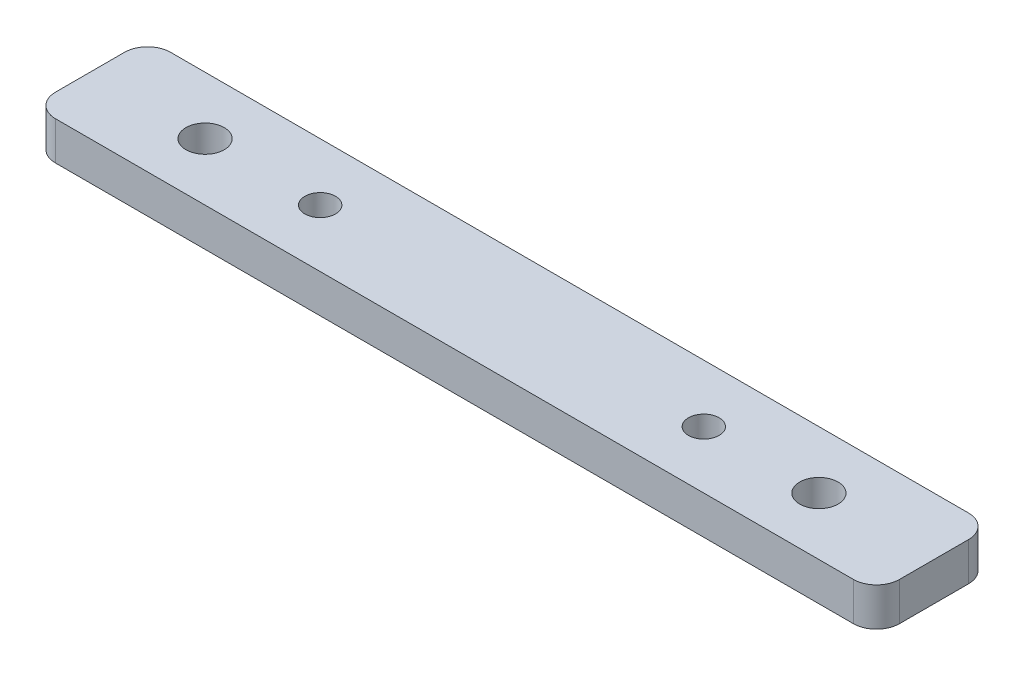
ISO-10303-21;
HEADER;
FILE_DESCRIPTION(('STEP AP214'),'2;1');
FILE_NAME('part.step','',(''),(''),'','','');
FILE_SCHEMA(('AUTOMOTIVE_DESIGN { 1 0 10303 214 1 1 1 1 }'));
ENDSEC;
DATA;
#1=APPLICATION_CONTEXT('core data for automotive mechanical design processes');
#2=APPLICATION_PROTOCOL_DEFINITION('international standard','automotive_design',2000,#1);
#3=PRODUCT_CONTEXT('',#1,'mechanical');
#4=PRODUCT('Part','Part','',(#3));
#5=PRODUCT_RELATED_PRODUCT_CATEGORY('part','',(#4));
#6=PRODUCT_DEFINITION_FORMATION('','',#4);
#7=PRODUCT_DEFINITION_CONTEXT('part definition',#1,'design');
#8=PRODUCT_DEFINITION('design','',#6,#7);
#9=PRODUCT_DEFINITION_SHAPE('','',#8);
#10=(LENGTH_UNIT() NAMED_UNIT(*) SI_UNIT(.MILLI.,.METRE.));
#11=(NAMED_UNIT(*) PLANE_ANGLE_UNIT() SI_UNIT($,.RADIAN.));
#12=(NAMED_UNIT(*) SI_UNIT($,.STERADIAN.) SOLID_ANGLE_UNIT());
#13=UNCERTAINTY_MEASURE_WITH_UNIT(LENGTH_MEASURE(1.E-05),#10,'distance_accuracy_value','');
#14=(GEOMETRIC_REPRESENTATION_CONTEXT(3) GLOBAL_UNCERTAINTY_ASSIGNED_CONTEXT((#13)) GLOBAL_UNIT_ASSIGNED_CONTEXT((#10,
#11,#12)) REPRESENTATION_CONTEXT('',''));
#15=CARTESIAN_POINT('',(0.,0.,0.));
#16=DIRECTION('',(0.,0.,1.));
#17=DIRECTION('',(1.,0.,0.));
#18=AXIS2_PLACEMENT_3D('',#15,#16,#17);
#19=CARTESIAN_POINT('',(55.,5.,7.5));
#20=DIRECTION('',(-1.,0.,0.));
#21=DIRECTION('',(0.,0.,1.));
#22=AXIS2_PLACEMENT_3D('',#19,#20,#21);
#23=PLANE('',#22);
#24=DIRECTION('',(0.,0.,-1.));
#25=VECTOR('',#24,1.);
#26=CARTESIAN_POINT('',(55.,5.,7.5));
#27=LINE('',#26,#25);
#28=CARTESIAN_POINT('',(55.,5.,4.5));
#29=VERTEX_POINT('',#28);
#30=CARTESIAN_POINT('',(55.,5.,-4.5));
#31=VERTEX_POINT('',#30);
#32=EDGE_CURVE('E137',#29,#31,#27,.T.);
#33=ORIENTED_EDGE('',*,*,#32,.F.);
#34=DIRECTION('',(0.,-1.,0.));
#35=VECTOR('',#34,1.);
#36=CARTESIAN_POINT('',(55.,5.,4.5));
#37=LINE('',#36,#35);
#38=CARTESIAN_POINT('',(55.,0.,4.5));
#39=VERTEX_POINT('',#38);
#40=EDGE_CURVE('E11',#29,#39,#37,.T.);
#41=ORIENTED_EDGE('',*,*,#40,.T.);
#42=DIRECTION('',(0.,0.,-1.));
#43=VECTOR('',#42,1.);
#44=CARTESIAN_POINT('',(55.,0.,7.5));
#45=LINE('',#44,#43);
#46=CARTESIAN_POINT('',(55.,0.,-4.5));
#47=VERTEX_POINT('',#46);
#48=EDGE_CURVE('E183',#39,#47,#45,.T.);
#49=ORIENTED_EDGE('',*,*,#48,.T.);
#50=DIRECTION('',(0.,-1.,0.));
#51=VECTOR('',#50,1.);
#52=CARTESIAN_POINT('',(55.,5.,-4.5));
#53=LINE('',#52,#51);
#54=EDGE_CURVE('E48',#47,#31,#53,.F.);
#55=ORIENTED_EDGE('',*,*,#54,.T.);
#56=EDGE_LOOP('',(#33,#41,#49,#55));
#57=FACE_BOUND('',#56,.T.);
#58=ADVANCED_FACE('F39',(#57),#23,.F.);
#59=CARTESIAN_POINT('',(-55.,5.,-7.5));
#60=DIRECTION('',(0.,0.,1.));
#61=DIRECTION('',(1.,0.,0.));
#62=AXIS2_PLACEMENT_3D('',#59,#60,#61);
#63=PLANE('',#62);
#64=DIRECTION('',(-1.,0.,0.));
#65=VECTOR('',#64,1.);
#66=CARTESIAN_POINT('',(-55.,0.,-7.5));
#67=LINE('',#66,#65);
#68=CARTESIAN_POINT('',(52.,0.,-7.5));
#69=VERTEX_POINT('',#68);
#70=CARTESIAN_POINT('',(-52.,0.,-7.5));
#71=VERTEX_POINT('',#70);
#72=EDGE_CURVE('E144',#69,#71,#67,.T.);
#73=ORIENTED_EDGE('',*,*,#72,.T.);
#74=DIRECTION('',(0.,-1.,0.));
#75=VECTOR('',#74,1.);
#76=CARTESIAN_POINT('',(-52.,5.,-7.5));
#77=LINE('',#76,#75);
#78=CARTESIAN_POINT('',(-52.,5.,-7.5));
#79=VERTEX_POINT('',#78);
#80=EDGE_CURVE('E55',#71,#79,#77,.F.);
#81=ORIENTED_EDGE('',*,*,#80,.T.);
#82=DIRECTION('',(-1.,0.,0.));
#83=VECTOR('',#82,1.);
#84=CARTESIAN_POINT('',(-55.,5.,-7.5));
#85=LINE('',#84,#83);
#86=CARTESIAN_POINT('',(52.,5.,-7.5));
#87=VERTEX_POINT('',#86);
#88=EDGE_CURVE('E142',#87,#79,#85,.T.);
#89=ORIENTED_EDGE('',*,*,#88,.F.);
#90=DIRECTION('',(0.,-1.,0.));
#91=VECTOR('',#90,1.);
#92=CARTESIAN_POINT('',(52.,5.,-7.5));
#93=LINE('',#92,#91);
#94=EDGE_CURVE('E172',#87,#69,#93,.T.);
#95=ORIENTED_EDGE('',*,*,#94,.T.);
#96=EDGE_LOOP('',(#73,#81,#89,#95));
#97=FACE_BOUND('',#96,.T.);
#98=ADVANCED_FACE('F190',(#97),#63,.F.);
#99=CARTESIAN_POINT('',(-55.,5.,7.5));
#100=DIRECTION('',(1.,0.,0.));
#101=DIRECTION('',(0.,0.,-1.));
#102=AXIS2_PLACEMENT_3D('',#99,#100,#101);
#103=PLANE('',#102);
#104=DIRECTION('',(0.,0.,1.));
#105=VECTOR('',#104,1.);
#106=CARTESIAN_POINT('',(-55.,0.,7.5));
#107=LINE('',#106,#105);
#108=CARTESIAN_POINT('',(-55.,0.,-4.5));
#109=VERTEX_POINT('',#108);
#110=CARTESIAN_POINT('',(-55.,0.,4.5));
#111=VERTEX_POINT('',#110);
#112=EDGE_CURVE('E138',#109,#111,#107,.T.);
#113=ORIENTED_EDGE('',*,*,#112,.T.);
#114=DIRECTION('',(0.,-1.,0.));
#115=VECTOR('',#114,1.);
#116=CARTESIAN_POINT('',(-55.,5.,4.5));
#117=LINE('',#116,#115);
#118=CARTESIAN_POINT('',(-55.,5.,4.5));
#119=VERTEX_POINT('',#118);
#120=EDGE_CURVE('E112',#111,#119,#117,.F.);
#121=ORIENTED_EDGE('',*,*,#120,.T.);
#122=DIRECTION('',(0.,0.,1.));
#123=VECTOR('',#122,1.);
#124=CARTESIAN_POINT('',(-55.,5.,7.5));
#125=LINE('',#124,#123);
#126=CARTESIAN_POINT('',(-55.,5.,-4.5));
#127=VERTEX_POINT('',#126);
#128=EDGE_CURVE('E198',#127,#119,#125,.T.);
#129=ORIENTED_EDGE('',*,*,#128,.F.);
#130=DIRECTION('',(0.,-1.,0.));
#131=VECTOR('',#130,1.);
#132=CARTESIAN_POINT('',(-55.,5.,-4.5));
#133=LINE('',#132,#131);
#134=EDGE_CURVE('E118',#127,#109,#133,.T.);
#135=ORIENTED_EDGE('',*,*,#134,.T.);
#136=EDGE_LOOP('',(#113,#121,#129,#135));
#137=FACE_BOUND('',#136,.T.);
#138=ADVANCED_FACE('F272',(#137),#103,.F.);
#139=CARTESIAN_POINT('',(-55.,5.,7.5));
#140=DIRECTION('',(0.,0.,-1.));
#141=DIRECTION('',(-1.,0.,0.));
#142=AXIS2_PLACEMENT_3D('',#139,#140,#141);
#143=PLANE('',#142);
#144=DIRECTION('',(1.,0.,0.));
#145=VECTOR('',#144,1.);
#146=CARTESIAN_POINT('',(-55.,5.,7.5));
#147=LINE('',#146,#145);
#148=CARTESIAN_POINT('',(-52.,5.,7.5));
#149=VERTEX_POINT('',#148);
#150=CARTESIAN_POINT('',(52.,5.,7.5));
#151=VERTEX_POINT('',#150);
#152=EDGE_CURVE('E128',#149,#151,#147,.T.);
#153=ORIENTED_EDGE('',*,*,#152,.F.);
#154=DIRECTION('',(0.,-1.,0.));
#155=VECTOR('',#154,1.);
#156=CARTESIAN_POINT('',(-52.,5.,7.5));
#157=LINE('',#156,#155);
#158=CARTESIAN_POINT('',(-52.,0.,7.5));
#159=VERTEX_POINT('',#158);
#160=EDGE_CURVE('E111',#149,#159,#157,.T.);
#161=ORIENTED_EDGE('',*,*,#160,.T.);
#162=DIRECTION('',(1.,0.,0.));
#163=VECTOR('',#162,1.);
#164=CARTESIAN_POINT('',(-55.,0.,7.5));
#165=LINE('',#164,#163);
#166=CARTESIAN_POINT('',(52.,0.,7.5));
#167=VERTEX_POINT('',#166);
#168=EDGE_CURVE('E125',#159,#167,#165,.T.);
#169=ORIENTED_EDGE('',*,*,#168,.T.);
#170=DIRECTION('',(0.,-1.,0.));
#171=VECTOR('',#170,1.);
#172=CARTESIAN_POINT('',(52.,5.,7.5));
#173=LINE('',#172,#171);
#174=EDGE_CURVE('E131',#167,#151,#173,.F.);
#175=ORIENTED_EDGE('',*,*,#174,.T.);
#176=EDGE_LOOP('',(#153,#161,#169,#175));
#177=FACE_BOUND('',#176,.T.);
#178=ADVANCED_FACE('F124',(#177),#143,.F.);
#179=CARTESIAN_POINT('',(0.,5.,0.));
#180=DIRECTION('',(0.,-1.,0.));
#181=DIRECTION('',(0.,0.,-1.));
#182=AXIS2_PLACEMENT_3D('',#179,#180,#181);
#183=PLANE('',#182);
#184=CARTESIAN_POINT('',(40.,5.,0.));
#185=DIRECTION('',(0.,1.,0.));
#186=DIRECTION('',(0.,0.,1.));
#187=AXIS2_PLACEMENT_3D('',#184,#185,#186);
#188=CIRCLE('',#187,2.5);
#189=CARTESIAN_POINT('',(40.,5.,2.5));
#190=VERTEX_POINT('',#189);
#191=EDGE_CURVE('E220',#190,#190,#188,.T.);
#192=ORIENTED_EDGE('',*,*,#191,.F.);
#193=EDGE_LOOP('',(#192));
#194=FACE_BOUND('',#193,.T.);
#195=CARTESIAN_POINT('',(-25.,5.,2.30718222304915E-13));
#196=DIRECTION('',(0.,1.,0.));
#197=DIRECTION('',(0.,0.,-1.));
#198=AXIS2_PLACEMENT_3D('',#195,#196,#197);
#199=CIRCLE('',#198,2.);
#200=CARTESIAN_POINT('',(-25.,5.,-1.99999999999977));
#201=VERTEX_POINT('',#200);
#202=EDGE_CURVE('E221',#201,#201,#199,.T.);
#203=ORIENTED_EDGE('',*,*,#202,.F.);
#204=EDGE_LOOP('',(#203));
#205=FACE_BOUND('',#204,.T.);
#206=CARTESIAN_POINT('',(-40.,5.,3.6949610038306E-13));
#207=DIRECTION('',(0.,1.,0.));
#208=DIRECTION('',(0.,0.,-1.));
#209=AXIS2_PLACEMENT_3D('',#206,#207,#208);
#210=CIRCLE('',#209,2.5);
#211=CARTESIAN_POINT('',(-40.,5.,-2.49999999999963));
#212=VERTEX_POINT('',#211);
#213=EDGE_CURVE('E203',#212,#212,#210,.T.);
#214=ORIENTED_EDGE('',*,*,#213,.F.);
#215=EDGE_LOOP('',(#214));
#216=FACE_BOUND('',#215,.T.);
#217=CARTESIAN_POINT('',(25.,5.,0.));
#218=DIRECTION('',(0.,1.,0.));
#219=DIRECTION('',(0.,0.,1.));
#220=AXIS2_PLACEMENT_3D('',#217,#218,#219);
#221=CIRCLE('',#220,2.);
#222=CARTESIAN_POINT('',(25.,5.,2.));
#223=VERTEX_POINT('',#222);
#224=EDGE_CURVE('E212',#223,#223,#221,.T.);
#225=ORIENTED_EDGE('',*,*,#224,.F.);
#226=EDGE_LOOP('',(#225));
#227=FACE_BOUND('',#226,.T.);
#228=ORIENTED_EDGE('',*,*,#128,.T.);
#229=CARTESIAN_POINT('',(-52.,5.,4.5));
#230=DIRECTION('',(0.,-1.,0.));
#231=DIRECTION('',(0.,0.,-1.));
#232=AXIS2_PLACEMENT_3D('',#229,#230,#231);
#233=CIRCLE('',#232,3.);
#234=EDGE_CURVE('E169',#119,#149,#233,.F.);
#235=ORIENTED_EDGE('',*,*,#234,.T.);
#236=ORIENTED_EDGE('',*,*,#152,.T.);
#237=CARTESIAN_POINT('',(52.,5.,4.5));
#238=DIRECTION('',(0.,-1.,0.));
#239=DIRECTION('',(0.,0.,-1.));
#240=AXIS2_PLACEMENT_3D('',#237,#238,#239);
#241=CIRCLE('',#240,3.);
#242=EDGE_CURVE('E163',#151,#29,#241,.F.);
#243=ORIENTED_EDGE('',*,*,#242,.T.);
#244=ORIENTED_EDGE('',*,*,#32,.T.);
#245=CARTESIAN_POINT('',(52.,5.,-4.5));
#246=DIRECTION('',(0.,-1.,0.));
#247=DIRECTION('',(0.,0.,-1.));
#248=AXIS2_PLACEMENT_3D('',#245,#246,#247);
#249=CIRCLE('',#248,3.);
#250=EDGE_CURVE('E62',#31,#87,#249,.F.);
#251=ORIENTED_EDGE('',*,*,#250,.T.);
#252=ORIENTED_EDGE('',*,*,#88,.T.);
#253=CARTESIAN_POINT('',(-52.,5.,-4.5));
#254=DIRECTION('',(0.,-1.,0.));
#255=DIRECTION('',(0.,0.,-1.));
#256=AXIS2_PLACEMENT_3D('',#253,#254,#255);
#257=CIRCLE('',#256,3.);
#258=EDGE_CURVE('E166',#79,#127,#257,.F.);
#259=ORIENTED_EDGE('',*,*,#258,.T.);
#260=EDGE_LOOP('',(#228,#235,#236,#243,#244,#251,#252,#259));
#261=FACE_BOUND('',#260,.T.);
#262=ADVANCED_FACE('F186',(#194,#205,#216,#227,#261),#183,.F.);
#263=CARTESIAN_POINT('',(0.,0.,0.));
#264=DIRECTION('',(0.,-1.,0.));
#265=DIRECTION('',(0.,0.,-1.));
#266=AXIS2_PLACEMENT_3D('',#263,#264,#265);
#267=PLANE('',#266);
#268=CARTESIAN_POINT('',(40.,0.,0.));
#269=DIRECTION('',(0.,1.,0.));
#270=DIRECTION('',(0.,0.,1.));
#271=AXIS2_PLACEMENT_3D('',#268,#269,#270);
#272=CIRCLE('',#271,2.5);
#273=CARTESIAN_POINT('',(40.,0.,2.5));
#274=VERTEX_POINT('',#273);
#275=EDGE_CURVE('E193',#274,#274,#272,.T.);
#276=ORIENTED_EDGE('',*,*,#275,.T.);
#277=EDGE_LOOP('',(#276));
#278=FACE_BOUND('',#277,.T.);
#279=CARTESIAN_POINT('',(-25.,0.,2.30718222304915E-13));
#280=DIRECTION('',(0.,1.,0.));
#281=DIRECTION('',(0.,0.,-1.));
#282=AXIS2_PLACEMENT_3D('',#279,#280,#281);
#283=CIRCLE('',#282,2.);
#284=CARTESIAN_POINT('',(-25.,0.,-1.99999999999977));
#285=VERTEX_POINT('',#284);
#286=EDGE_CURVE('E208',#285,#285,#283,.T.);
#287=ORIENTED_EDGE('',*,*,#286,.T.);
#288=EDGE_LOOP('',(#287));
#289=FACE_BOUND('',#288,.T.);
#290=CARTESIAN_POINT('',(-40.,0.,3.6949610038306E-13));
#291=DIRECTION('',(0.,1.,0.));
#292=DIRECTION('',(0.,0.,-1.));
#293=AXIS2_PLACEMENT_3D('',#290,#291,#292);
#294=CIRCLE('',#293,2.5);
#295=CARTESIAN_POINT('',(-40.,0.,-2.49999999999963));
#296=VERTEX_POINT('',#295);
#297=EDGE_CURVE('E207',#296,#296,#294,.T.);
#298=ORIENTED_EDGE('',*,*,#297,.T.);
#299=EDGE_LOOP('',(#298));
#300=FACE_BOUND('',#299,.T.);
#301=CARTESIAN_POINT('',(25.,0.,0.));
#302=DIRECTION('',(0.,1.,0.));
#303=DIRECTION('',(0.,0.,1.));
#304=AXIS2_PLACEMENT_3D('',#301,#302,#303);
#305=CIRCLE('',#304,2.);
#306=CARTESIAN_POINT('',(25.,0.,2.));
#307=VERTEX_POINT('',#306);
#308=EDGE_CURVE('E216',#307,#307,#305,.T.);
#309=ORIENTED_EDGE('',*,*,#308,.T.);
#310=EDGE_LOOP('',(#309));
#311=FACE_BOUND('',#310,.T.);
#312=ORIENTED_EDGE('',*,*,#168,.F.);
#313=CARTESIAN_POINT('',(-52.,0.,4.5));
#314=DIRECTION('',(0.,-1.,0.));
#315=DIRECTION('',(0.,0.,-1.));
#316=AXIS2_PLACEMENT_3D('',#313,#314,#315);
#317=CIRCLE('',#316,3.);
#318=EDGE_CURVE('E107',#159,#111,#317,.T.);
#319=ORIENTED_EDGE('',*,*,#318,.T.);
#320=ORIENTED_EDGE('',*,*,#112,.F.);
#321=CARTESIAN_POINT('',(-52.,0.,-4.5));
#322=DIRECTION('',(0.,-1.,0.));
#323=DIRECTION('',(0.,0.,-1.));
#324=AXIS2_PLACEMENT_3D('',#321,#322,#323);
#325=CIRCLE('',#324,3.);
#326=EDGE_CURVE('E119',#109,#71,#325,.T.);
#327=ORIENTED_EDGE('',*,*,#326,.T.);
#328=ORIENTED_EDGE('',*,*,#72,.F.);
#329=CARTESIAN_POINT('',(52.,0.,-4.5));
#330=DIRECTION('',(0.,-1.,0.));
#331=DIRECTION('',(0.,0.,-1.));
#332=AXIS2_PLACEMENT_3D('',#329,#330,#331);
#333=CIRCLE('',#332,3.);
#334=EDGE_CURVE('E130',#69,#47,#333,.T.);
#335=ORIENTED_EDGE('',*,*,#334,.T.);
#336=ORIENTED_EDGE('',*,*,#48,.F.);
#337=CARTESIAN_POINT('',(52.,0.,4.5));
#338=DIRECTION('',(0.,-1.,0.));
#339=DIRECTION('',(0.,0.,-1.));
#340=AXIS2_PLACEMENT_3D('',#337,#338,#339);
#341=CIRCLE('',#340,3.);
#342=EDGE_CURVE('E135',#39,#167,#341,.T.);
#343=ORIENTED_EDGE('',*,*,#342,.T.);
#344=EDGE_LOOP('',(#312,#319,#320,#327,#328,#335,#336,#343));
#345=FACE_BOUND('',#344,.T.);
#346=ADVANCED_FACE('F133',(#278,#289,#300,#311,#345),#267,.T.);
#347=CARTESIAN_POINT('',(-52.,5.,4.5));
#348=DIRECTION('',(0.,-1.,0.));
#349=DIRECTION('',(0.,0.,-1.));
#350=AXIS2_PLACEMENT_3D('',#347,#348,#349);
#351=CYLINDRICAL_SURFACE('',#350,3.);
#352=ORIENTED_EDGE('',*,*,#234,.F.);
#353=ORIENTED_EDGE('',*,*,#120,.F.);
#354=ORIENTED_EDGE('',*,*,#318,.F.);
#355=ORIENTED_EDGE('',*,*,#160,.F.);
#356=EDGE_LOOP('',(#352,#353,#354,#355));
#357=FACE_BOUND('',#356,.T.);
#358=ADVANCED_FACE('F110',(#357),#351,.T.);
#359=CARTESIAN_POINT('',(-52.,5.,-4.5));
#360=DIRECTION('',(0.,-1.,0.));
#361=DIRECTION('',(0.,0.,-1.));
#362=AXIS2_PLACEMENT_3D('',#359,#360,#361);
#363=CYLINDRICAL_SURFACE('',#362,3.);
#364=ORIENTED_EDGE('',*,*,#258,.F.);
#365=ORIENTED_EDGE('',*,*,#80,.F.);
#366=ORIENTED_EDGE('',*,*,#326,.F.);
#367=ORIENTED_EDGE('',*,*,#134,.F.);
#368=EDGE_LOOP('',(#364,#365,#366,#367));
#369=FACE_BOUND('',#368,.T.);
#370=ADVANCED_FACE('F278',(#369),#363,.T.);
#371=CARTESIAN_POINT('',(52.,5.,4.5));
#372=DIRECTION('',(0.,-1.,0.));
#373=DIRECTION('',(0.,0.,-1.));
#374=AXIS2_PLACEMENT_3D('',#371,#372,#373);
#375=CYLINDRICAL_SURFACE('',#374,3.);
#376=ORIENTED_EDGE('',*,*,#242,.F.);
#377=ORIENTED_EDGE('',*,*,#174,.F.);
#378=ORIENTED_EDGE('',*,*,#342,.F.);
#379=ORIENTED_EDGE('',*,*,#40,.F.);
#380=EDGE_LOOP('',(#376,#377,#378,#379));
#381=FACE_BOUND('',#380,.T.);
#382=ADVANCED_FACE('F264',(#381),#375,.T.);
#383=CARTESIAN_POINT('',(52.,5.,-4.5));
#384=DIRECTION('',(0.,-1.,0.));
#385=DIRECTION('',(0.,0.,-1.));
#386=AXIS2_PLACEMENT_3D('',#383,#384,#385);
#387=CYLINDRICAL_SURFACE('',#386,3.);
#388=ORIENTED_EDGE('',*,*,#250,.F.);
#389=ORIENTED_EDGE('',*,*,#54,.F.);
#390=ORIENTED_EDGE('',*,*,#334,.F.);
#391=ORIENTED_EDGE('',*,*,#94,.F.);
#392=EDGE_LOOP('',(#388,#389,#390,#391));
#393=FACE_BOUND('',#392,.T.);
#394=ADVANCED_FACE('F41',(#393),#387,.T.);
#395=CARTESIAN_POINT('',(25.,0.,0.));
#396=DIRECTION('',(0.,1.,0.));
#397=DIRECTION('',(0.,0.,1.));
#398=AXIS2_PLACEMENT_3D('',#395,#396,#397);
#399=CYLINDRICAL_SURFACE('',#398,2.);
#400=ORIENTED_EDGE('',*,*,#308,.F.);
#401=EDGE_LOOP('',(#400));
#402=FACE_BOUND('',#401,.T.);
#403=ORIENTED_EDGE('',*,*,#224,.T.);
#404=EDGE_LOOP('',(#403));
#405=FACE_BOUND('',#404,.T.);
#406=ADVANCED_FACE('F253',(#402,#405),#399,.F.);
#407=CARTESIAN_POINT('',(-40.,0.,3.6949610038306E-13));
#408=DIRECTION('',(0.,1.,0.));
#409=DIRECTION('',(0.,0.,1.));
#410=AXIS2_PLACEMENT_3D('',#407,#408,#409);
#411=CYLINDRICAL_SURFACE('',#410,2.5);
#412=ORIENTED_EDGE('',*,*,#297,.F.);
#413=EDGE_LOOP('',(#412));
#414=FACE_BOUND('',#413,.T.);
#415=ORIENTED_EDGE('',*,*,#213,.T.);
#416=EDGE_LOOP('',(#415));
#417=FACE_BOUND('',#416,.T.);
#418=ADVANCED_FACE('F255',(#414,#417),#411,.F.);
#419=CARTESIAN_POINT('',(-25.,0.,2.30718222304915E-13));
#420=DIRECTION('',(0.,1.,0.));
#421=DIRECTION('',(0.,0.,1.));
#422=AXIS2_PLACEMENT_3D('',#419,#420,#421);
#423=CYLINDRICAL_SURFACE('',#422,2.);
#424=ORIENTED_EDGE('',*,*,#286,.F.);
#425=EDGE_LOOP('',(#424));
#426=FACE_BOUND('',#425,.T.);
#427=ORIENTED_EDGE('',*,*,#202,.T.);
#428=EDGE_LOOP('',(#427));
#429=FACE_BOUND('',#428,.T.);
#430=ADVANCED_FACE('F240',(#426,#429),#423,.F.);
#431=CARTESIAN_POINT('',(40.,0.,0.));
#432=DIRECTION('',(0.,1.,0.));
#433=DIRECTION('',(0.,0.,1.));
#434=AXIS2_PLACEMENT_3D('',#431,#432,#433);
#435=CYLINDRICAL_SURFACE('',#434,2.5);
#436=ORIENTED_EDGE('',*,*,#275,.F.);
#437=EDGE_LOOP('',(#436));
#438=FACE_BOUND('',#437,.T.);
#439=ORIENTED_EDGE('',*,*,#191,.T.);
#440=EDGE_LOOP('',(#439));
#441=FACE_BOUND('',#440,.T.);
#442=ADVANCED_FACE('F237',(#438,#441),#435,.F.);
#443=CLOSED_SHELL('',(#58,#98,#138,#178,#262,#346,#358,#370,#382,#394,#406,#418,#430,#442));
#444=MANIFOLD_SOLID_BREP('B2',#443);
#445=ADVANCED_BREP_SHAPE_REPRESENTATION('',(#18,#444),#14);
#446=SHAPE_DEFINITION_REPRESENTATION(#9,#445);
ENDSEC;
END-ISO-10303-21;
